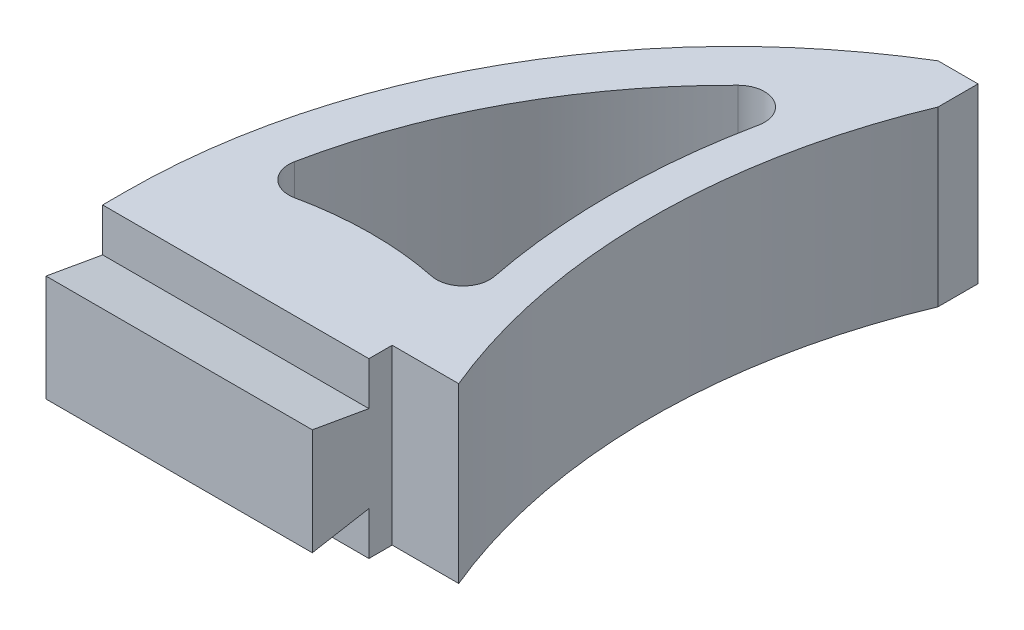
ISO-10303-21;
HEADER;
FILE_DESCRIPTION(('STEP AP214'),'2;1');
FILE_NAME('part.step','',(''),(''),'','','');
FILE_SCHEMA(('AUTOMOTIVE_DESIGN { 1 0 10303 214 1 1 1 1 }'));
ENDSEC;
DATA;
#1=APPLICATION_CONTEXT('core data for automotive mechanical design processes');
#2=APPLICATION_PROTOCOL_DEFINITION('international standard','automotive_design',2000,#1);
#3=PRODUCT_CONTEXT('',#1,'mechanical');
#4=PRODUCT('Part','Part','',(#3));
#5=PRODUCT_RELATED_PRODUCT_CATEGORY('part','',(#4));
#6=PRODUCT_DEFINITION_FORMATION('','',#4);
#7=PRODUCT_DEFINITION_CONTEXT('part definition',#1,'design');
#8=PRODUCT_DEFINITION('design','',#6,#7);
#9=PRODUCT_DEFINITION_SHAPE('','',#8);
#10=(LENGTH_UNIT() NAMED_UNIT(*) SI_UNIT(.MILLI.,.METRE.));
#11=(NAMED_UNIT(*) PLANE_ANGLE_UNIT() SI_UNIT($,.RADIAN.));
#12=(NAMED_UNIT(*) SI_UNIT($,.STERADIAN.) SOLID_ANGLE_UNIT());
#13=UNCERTAINTY_MEASURE_WITH_UNIT(LENGTH_MEASURE(1.E-05),#10,'distance_accuracy_value','');
#14=(GEOMETRIC_REPRESENTATION_CONTEXT(3) GLOBAL_UNCERTAINTY_ASSIGNED_CONTEXT((#13)) GLOBAL_UNIT_ASSIGNED_CONTEXT((#10,
#11,#12)) REPRESENTATION_CONTEXT('',''));
#15=CARTESIAN_POINT('',(0.,0.,0.));
#16=DIRECTION('',(0.,0.,1.));
#17=DIRECTION('',(1.,0.,0.));
#18=AXIS2_PLACEMENT_3D('',#15,#16,#17);
#19=CARTESIAN_POINT('',(45.5681818181818,13.,0.));
#20=DIRECTION('',(0.,-1.,0.));
#21=DIRECTION('',(0.,0.,-1.));
#22=AXIS2_PLACEMENT_3D('',#19,#20,#21);
#23=CYLINDRICAL_SURFACE('',#22,42.);
#24=CARTESIAN_POINT('',(45.5681818181818,0.,0.));
#25=DIRECTION('',(0.,1.,0.));
#26=DIRECTION('',(0.,0.,1.));
#27=AXIS2_PLACEMENT_3D('',#24,#25,#26);
#28=CIRCLE('',#27,42.);
#29=CARTESIAN_POINT('',(16.0800590579463,0.,-29.9073672541947));
#30=VERTEX_POINT('',#29);
#31=CARTESIAN_POINT('',(4.39239940253098,0.,-8.27979120865837));
#32=VERTEX_POINT('',#31);
#33=EDGE_CURVE('E259',#30,#32,#28,.T.);
#34=ORIENTED_EDGE('',*,*,#33,.F.);
#35=DIRECTION('',(0.,-1.,0.));
#36=VECTOR('',#35,1.);
#37=CARTESIAN_POINT('',(16.0800590579463,13.,-29.9073672541947));
#38=LINE('',#37,#36);
#39=CARTESIAN_POINT('',(16.0800590579463,13.,-29.9073672541947));
#40=VERTEX_POINT('',#39);
#41=EDGE_CURVE('E300',#40,#30,#38,.T.);
#42=ORIENTED_EDGE('',*,*,#41,.F.);
#43=CARTESIAN_POINT('',(45.5681818181818,13.,0.));
#44=DIRECTION('',(0.,1.,0.));
#45=DIRECTION('',(0.,0.,1.));
#46=AXIS2_PLACEMENT_3D('',#43,#44,#45);
#47=CIRCLE('',#46,42.);
#48=CARTESIAN_POINT('',(4.39239940253098,13.,-8.27979120865837));
#49=VERTEX_POINT('',#48);
#50=EDGE_CURVE('E202',#40,#49,#47,.T.);
#51=ORIENTED_EDGE('',*,*,#50,.T.);
#52=DIRECTION('',(0.,-1.,0.));
#53=VECTOR('',#52,1.);
#54=CARTESIAN_POINT('',(4.39239940253098,13.,-8.27979120865837));
#55=LINE('',#54,#53);
#56=EDGE_CURVE('E284',#49,#32,#55,.T.);
#57=ORIENTED_EDGE('',*,*,#56,.T.);
#58=EDGE_LOOP('',(#34,#42,#51,#57));
#59=FACE_BOUND('',#58,.T.);
#60=ADVANCED_FACE('F47',(#59),#23,.F.);
#61=CARTESIAN_POINT('',(17.4842553798623,13.,-28.4832069087568));
#62=DIRECTION('',(0.,-1.,0.));
#63=DIRECTION('',(0.,0.,-1.));
#64=AXIS2_PLACEMENT_3D('',#61,#62,#63);
#65=CYLINDRICAL_SURFACE('',#64,2.);
#66=CARTESIAN_POINT('',(17.4842553798623,0.,-28.4832069087568));
#67=DIRECTION('',(0.,1.,0.));
#68=DIRECTION('',(0.,0.,1.));
#69=AXIS2_PLACEMENT_3D('',#66,#67,#68);
#70=CIRCLE('',#69,2.);
#71=CARTESIAN_POINT('',(19.443191199567,0.,-28.0800066430354));
#72=VERTEX_POINT('',#71);
#73=EDGE_CURVE('E263',#30,#72,#70,.F.);
#74=ORIENTED_EDGE('',*,*,#73,.T.);
#75=DIRECTION('',(0.,-1.,0.));
#76=VECTOR('',#75,1.);
#77=CARTESIAN_POINT('',(19.443191199567,13.,-28.0800066430354));
#78=LINE('',#77,#76);
#79=CARTESIAN_POINT('',(19.443191199567,13.,-28.0800066430354));
#80=VERTEX_POINT('',#79);
#81=EDGE_CURVE('E297',#80,#72,#78,.T.);
#82=ORIENTED_EDGE('',*,*,#81,.F.);
#83=CARTESIAN_POINT('',(17.4842553798623,13.,-28.4832069087568));
#84=DIRECTION('',(0.,1.,0.));
#85=DIRECTION('',(0.,0.,1.));
#86=AXIS2_PLACEMENT_3D('',#83,#84,#85);
#87=CIRCLE('',#86,2.);
#88=EDGE_CURVE('E211',#40,#80,#87,.F.);
#89=ORIENTED_EDGE('',*,*,#88,.F.);
#90=ORIENTED_EDGE('',*,*,#41,.T.);
#91=EDGE_LOOP('',(#74,#82,#89,#90));
#92=FACE_BOUND('',#91,.T.);
#93=ADVANCED_FACE('F414',(#92),#65,.F.);
#94=CARTESIAN_POINT('',(68.4165866921848,13.,-18.));
#95=DIRECTION('',(0.,-1.,0.));
#96=DIRECTION('',(0.,0.,-1.));
#97=AXIS2_PLACEMENT_3D('',#94,#95,#96);
#98=CYLINDRICAL_SURFACE('',#97,50.);
#99=CARTESIAN_POINT('',(68.4165866921848,0.,-18.));
#100=DIRECTION('',(0.,1.,0.));
#101=DIRECTION('',(0.,0.,1.));
#102=AXIS2_PLACEMENT_3D('',#99,#100,#101);
#103=CIRCLE('',#102,50.);
#104=CARTESIAN_POINT('',(19.3623801460154,0.,-8.32090809395071));
#105=VERTEX_POINT('',#104);
#106=EDGE_CURVE('E267',#105,#72,#103,.F.);
#107=ORIENTED_EDGE('',*,*,#106,.F.);
#108=DIRECTION('',(0.,-1.,0.));
#109=VECTOR('',#108,1.);
#110=CARTESIAN_POINT('',(19.3623801460154,13.,-8.32090809395071));
#111=LINE('',#110,#109);
#112=CARTESIAN_POINT('',(19.3623801460154,13.,-8.32090809395071));
#113=VERTEX_POINT('',#112);
#114=EDGE_CURVE('E294',#113,#105,#111,.T.);
#115=ORIENTED_EDGE('',*,*,#114,.F.);
#116=CARTESIAN_POINT('',(68.4165866921848,13.,-18.));
#117=DIRECTION('',(0.,1.,0.));
#118=DIRECTION('',(0.,0.,1.));
#119=AXIS2_PLACEMENT_3D('',#116,#117,#118);
#120=CIRCLE('',#119,50.);
#121=EDGE_CURVE('E214',#113,#80,#120,.F.);
#122=ORIENTED_EDGE('',*,*,#121,.T.);
#123=ORIENTED_EDGE('',*,*,#81,.T.);
#124=EDGE_LOOP('',(#107,#115,#122,#123));
#125=FACE_BOUND('',#124,.T.);
#126=ADVANCED_FACE('F420',(#125),#98,.T.);
#127=CARTESIAN_POINT('',(17.4002118841686,13.,-7.93374441770875));
#128=DIRECTION('',(0.,-1.,0.));
#129=DIRECTION('',(0.,0.,-1.));
#130=AXIS2_PLACEMENT_3D('',#127,#128,#129);
#131=CYLINDRICAL_SURFACE('',#130,2.);
#132=CARTESIAN_POINT('',(17.4002118841686,0.,-7.93374441770875));
#133=DIRECTION('',(0.,1.,0.));
#134=DIRECTION('',(0.,0.,1.));
#135=AXIS2_PLACEMENT_3D('',#132,#133,#134);
#136=CIRCLE('',#135,2.);
#137=CARTESIAN_POINT('',(16.9996082789078,0.,-5.97427593073273));
#138=VERTEX_POINT('',#137);
#139=EDGE_CURVE('E271',#138,#105,#136,.T.);
#140=ORIENTED_EDGE('',*,*,#139,.F.);
#141=DIRECTION('',(0.,-1.,0.));
#142=VECTOR('',#141,1.);
#143=CARTESIAN_POINT('',(16.9996082789078,13.,-5.97427593073273));
#144=LINE('',#143,#142);
#145=CARTESIAN_POINT('',(16.9996082789078,13.,-5.97427593073273));
#146=VERTEX_POINT('',#145);
#147=EDGE_CURVE('E291',#146,#138,#144,.T.);
#148=ORIENTED_EDGE('',*,*,#147,.F.);
#149=CARTESIAN_POINT('',(17.4002118841686,13.,-7.93374441770875));
#150=DIRECTION('',(0.,1.,0.));
#151=DIRECTION('',(0.,0.,1.));
#152=AXIS2_PLACEMENT_3D('',#149,#150,#151);
#153=CIRCLE('',#152,2.);
#154=EDGE_CURVE('E218',#146,#113,#153,.T.);
#155=ORIENTED_EDGE('',*,*,#154,.T.);
#156=ORIENTED_EDGE('',*,*,#114,.T.);
#157=EDGE_LOOP('',(#140,#148,#155,#156));
#158=FACE_BOUND('',#157,.T.);
#159=ADVANCED_FACE('F574',(#158),#131,.F.);
#160=CARTESIAN_POINT('',(11.9920632131476,13.,18.5190801564673));
#161=DIRECTION('',(0.,-1.,0.));
#162=DIRECTION('',(0.,0.,-1.));
#163=AXIS2_PLACEMENT_3D('',#160,#161,#162);
#164=CYLINDRICAL_SURFACE('',#163,25.);
#165=CARTESIAN_POINT('',(11.9920632131476,0.,18.5190801564673));
#166=DIRECTION('',(0.,1.,0.));
#167=DIRECTION('',(0.,0.,1.));
#168=AXIS2_PLACEMENT_3D('',#165,#166,#167);
#169=CIRCLE('',#168,25.);
#170=CARTESIAN_POINT('',(6.77084815109741,0.,-5.92961946694456));
#171=VERTEX_POINT('',#170);
#172=EDGE_CURVE('E275',#171,#138,#169,.F.);
#173=ORIENTED_EDGE('',*,*,#172,.F.);
#174=DIRECTION('',(0.,-1.,0.));
#175=VECTOR('',#174,1.);
#176=CARTESIAN_POINT('',(6.77084815109741,13.,-5.92961946694456));
#177=LINE('',#176,#175);
#178=CARTESIAN_POINT('',(6.77084815109741,13.,-5.92961946694456));
#179=VERTEX_POINT('',#178);
#180=EDGE_CURVE('E287',#179,#171,#177,.T.);
#181=ORIENTED_EDGE('',*,*,#180,.F.);
#182=CARTESIAN_POINT('',(11.9920632131476,13.,18.5190801564673));
#183=DIRECTION('',(0.,1.,0.));
#184=DIRECTION('',(0.,0.,1.));
#185=AXIS2_PLACEMENT_3D('',#182,#183,#184);
#186=CIRCLE('',#185,25.);
#187=EDGE_CURVE('E222',#179,#146,#186,.F.);
#188=ORIENTED_EDGE('',*,*,#187,.T.);
#189=ORIENTED_EDGE('',*,*,#147,.T.);
#190=EDGE_LOOP('',(#173,#181,#188,#189));
#191=FACE_BOUND('',#190,.T.);
#192=ADVANCED_FACE('F565',(#191),#164,.T.);
#193=CARTESIAN_POINT('',(0.,13.,0.));
#194=DIRECTION('',(0.,0.,-1.));
#195=DIRECTION('',(-1.,0.,0.));
#196=AXIS2_PLACEMENT_3D('',#193,#194,#195);
#197=PLANE('',#196);
#198=DIRECTION('',(1.,0.,0.));
#199=VECTOR('',#198,1.);
#200=CARTESIAN_POINT('',(0.,0.,0.));
#201=LINE('',#200,#199);
#202=CARTESIAN_POINT('',(20.,0.,0.));
#203=VERTEX_POINT('',#202);
#204=CARTESIAN_POINT('',(25.,0.,0.));
#205=VERTEX_POINT('',#204);
#206=EDGE_CURVE('E231',#203,#205,#201,.T.);
#207=ORIENTED_EDGE('',*,*,#206,.T.);
#208=DIRECTION('',(0.,-1.,0.));
#209=VECTOR('',#208,1.);
#210=CARTESIAN_POINT('',(25.,13.,0.));
#211=LINE('',#210,#209);
#212=CARTESIAN_POINT('',(25.,13.,0.));
#213=VERTEX_POINT('',#212);
#214=EDGE_CURVE('E288',#213,#205,#211,.T.);
#215=ORIENTED_EDGE('',*,*,#214,.F.);
#216=DIRECTION('',(1.,0.,0.));
#217=VECTOR('',#216,1.);
#218=CARTESIAN_POINT('',(0.,13.,0.));
#219=LINE('',#218,#217);
#220=CARTESIAN_POINT('',(20.,13.,0.));
#221=VERTEX_POINT('',#220);
#222=EDGE_CURVE('E283',#221,#213,#219,.T.);
#223=ORIENTED_EDGE('',*,*,#222,.F.);
#224=DIRECTION('',(0.,-1.,0.));
#225=VECTOR('',#224,1.);
#226=CARTESIAN_POINT('',(20.,13.,0.));
#227=LINE('',#226,#225);
#228=EDGE_CURVE('E230',#221,#203,#227,.T.);
#229=ORIENTED_EDGE('',*,*,#228,.T.);
#230=EDGE_LOOP('',(#207,#215,#223,#229));
#231=FACE_BOUND('',#230,.T.);
#232=ADVANCED_FACE('F49',(#231),#197,.F.);
#233=CARTESIAN_POINT('',(68.4165866921848,13.,-18.));
#234=DIRECTION('',(0.,-1.,0.));
#235=DIRECTION('',(0.,0.,-1.));
#236=AXIS2_PLACEMENT_3D('',#233,#234,#235);
#237=CYLINDRICAL_SURFACE('',#236,47.);
#238=CARTESIAN_POINT('',(68.4165866921848,0.,-18.));
#239=DIRECTION('',(0.,1.,0.));
#240=DIRECTION('',(0.,0.,1.));
#241=AXIS2_PLACEMENT_3D('',#238,#239,#240);
#242=CIRCLE('',#241,47.);
#243=CARTESIAN_POINT('',(25.,0.,-36.));
#244=VERTEX_POINT('',#243);
#245=EDGE_CURVE('E235',#205,#244,#242,.F.);
#246=ORIENTED_EDGE('',*,*,#245,.T.);
#247=DIRECTION('',(0.,-1.,0.));
#248=VECTOR('',#247,1.);
#249=CARTESIAN_POINT('',(25.,13.,-36.));
#250=LINE('',#249,#248);
#251=CARTESIAN_POINT('',(25.,13.,-36.));
#252=VERTEX_POINT('',#251);
#253=EDGE_CURVE('E322',#252,#244,#250,.T.);
#254=ORIENTED_EDGE('',*,*,#253,.F.);
#255=CARTESIAN_POINT('',(68.4165866921848,13.,-18.));
#256=DIRECTION('',(0.,1.,0.));
#257=DIRECTION('',(0.,0.,1.));
#258=AXIS2_PLACEMENT_3D('',#255,#256,#257);
#259=CIRCLE('',#258,47.);
#260=EDGE_CURVE('E374',#213,#252,#259,.F.);
#261=ORIENTED_EDGE('',*,*,#260,.F.);
#262=ORIENTED_EDGE('',*,*,#214,.T.);
#263=EDGE_LOOP('',(#246,#254,#261,#262));
#264=FACE_BOUND('',#263,.T.);
#265=ADVANCED_FACE('F402',(#264),#237,.F.);
#266=CARTESIAN_POINT('',(25.,13.,0.));
#267=DIRECTION('',(1.,0.,0.));
#268=DIRECTION('',(0.,0.,-1.));
#269=AXIS2_PLACEMENT_3D('',#266,#267,#268);
#270=PLANE('',#269);
#271=DIRECTION('',(0.,0.,1.));
#272=VECTOR('',#271,1.);
#273=CARTESIAN_POINT('',(25.,0.,0.));
#274=LINE('',#273,#272);
#275=CARTESIAN_POINT('',(25.,0.,-39.));
#276=VERTEX_POINT('',#275);
#277=EDGE_CURVE('E239',#276,#244,#274,.T.);
#278=ORIENTED_EDGE('',*,*,#277,.F.);
#279=DIRECTION('',(0.,-1.,0.));
#280=VECTOR('',#279,1.);
#281=CARTESIAN_POINT('',(25.,13.,-39.));
#282=LINE('',#281,#280);
#283=CARTESIAN_POINT('',(25.,13.,-39.));
#284=VERTEX_POINT('',#283);
#285=EDGE_CURVE('E319',#284,#276,#282,.T.);
#286=ORIENTED_EDGE('',*,*,#285,.F.);
#287=DIRECTION('',(0.,0.,1.));
#288=VECTOR('',#287,1.);
#289=CARTESIAN_POINT('',(25.,13.,0.));
#290=LINE('',#289,#288);
#291=EDGE_CURVE('E377',#284,#252,#290,.T.);
#292=ORIENTED_EDGE('',*,*,#291,.T.);
#293=ORIENTED_EDGE('',*,*,#253,.T.);
#294=EDGE_LOOP('',(#278,#286,#292,#293));
#295=FACE_BOUND('',#294,.T.);
#296=ADVANCED_FACE('F405',(#295),#270,.T.);
#297=CARTESIAN_POINT('',(0.,13.,-39.));
#298=DIRECTION('',(0.,0.,1.));
#299=DIRECTION('',(1.,0.,0.));
#300=AXIS2_PLACEMENT_3D('',#297,#298,#299);
#301=PLANE('',#300);
#302=DIRECTION('',(-1.,0.,0.));
#303=VECTOR('',#302,1.);
#304=CARTESIAN_POINT('',(0.,0.,-39.));
#305=LINE('',#304,#303);
#306=CARTESIAN_POINT('',(22.,0.,-39.));
#307=VERTEX_POINT('',#306);
#308=EDGE_CURVE('E243',#276,#307,#305,.T.);
#309=ORIENTED_EDGE('',*,*,#308,.T.);
#310=DIRECTION('',(0.,-1.,0.));
#311=VECTOR('',#310,1.);
#312=CARTESIAN_POINT('',(22.,13.,-39.));
#313=LINE('',#312,#311);
#314=CARTESIAN_POINT('',(22.,13.,-39.));
#315=VERTEX_POINT('',#314);
#316=EDGE_CURVE('E316',#315,#307,#313,.T.);
#317=ORIENTED_EDGE('',*,*,#316,.F.);
#318=DIRECTION('',(-1.,0.,0.));
#319=VECTOR('',#318,1.);
#320=CARTESIAN_POINT('',(0.,13.,-39.));
#321=LINE('',#320,#319);
#322=EDGE_CURVE('E204',#284,#315,#321,.T.);
#323=ORIENTED_EDGE('',*,*,#322,.F.);
#324=ORIENTED_EDGE('',*,*,#285,.T.);
#325=EDGE_LOOP('',(#309,#317,#323,#324));
#326=FACE_BOUND('',#325,.T.);
#327=ADVANCED_FACE('F385',(#326),#301,.F.);
#328=CARTESIAN_POINT('',(45.5681818181818,13.,0.));
#329=DIRECTION('',(0.,-1.,0.));
#330=DIRECTION('',(0.,0.,-1.));
#331=AXIS2_PLACEMENT_3D('',#328,#329,#330);
#332=CYLINDRICAL_SURFACE('',#331,45.5681818181818);
#333=CARTESIAN_POINT('',(45.5681818181818,0.,0.));
#334=DIRECTION('',(0.,1.,0.));
#335=DIRECTION('',(0.,0.,1.));
#336=AXIS2_PLACEMENT_3D('',#333,#334,#335);
#337=CIRCLE('',#336,45.5681818181818);
#338=CARTESIAN_POINT('',(0.,0.,0.));
#339=VERTEX_POINT('',#338);
#340=EDGE_CURVE('E247',#339,#307,#337,.F.);
#341=ORIENTED_EDGE('',*,*,#340,.F.);
#342=DIRECTION('',(0.,-1.,0.));
#343=VECTOR('',#342,1.);
#344=CARTESIAN_POINT('',(0.,13.,0.));
#345=LINE('',#344,#343);
#346=CARTESIAN_POINT('',(0.,13.,0.));
#347=VERTEX_POINT('',#346);
#348=EDGE_CURVE('E313',#347,#339,#345,.T.);
#349=ORIENTED_EDGE('',*,*,#348,.F.);
#350=CARTESIAN_POINT('',(45.5681818181818,13.,0.));
#351=DIRECTION('',(0.,1.,0.));
#352=DIRECTION('',(0.,0.,1.));
#353=AXIS2_PLACEMENT_3D('',#350,#351,#352);
#354=CIRCLE('',#353,45.5681818181818);
#355=EDGE_CURVE('E196',#347,#315,#354,.F.);
#356=ORIENTED_EDGE('',*,*,#355,.T.);
#357=ORIENTED_EDGE('',*,*,#316,.T.);
#358=EDGE_LOOP('',(#341,#349,#356,#357));
#359=FACE_BOUND('',#358,.T.);
#360=ADVANCED_FACE('F389',(#359),#332,.T.);
#361=CARTESIAN_POINT('',(0.,13.,0.));
#362=DIRECTION('',(1.,0.,0.));
#363=DIRECTION('',(0.,0.,-1.));
#364=AXIS2_PLACEMENT_3D('',#361,#362,#363);
#365=PLANE('',#364);
#366=DIRECTION('',(0.,-1.,0.));
#367=VECTOR('',#366,1.);
#368=CARTESIAN_POINT('',(0.,13.,6.));
#369=LINE('',#368,#367);
#370=CARTESIAN_POINT('',(0.,10.5,6.));
#371=VERTEX_POINT('',#370);
#372=CARTESIAN_POINT('',(0.,2.5,6.));
#373=VERTEX_POINT('',#372);
#374=EDGE_CURVE('E309',#371,#373,#369,.T.);
#375=ORIENTED_EDGE('',*,*,#374,.F.);
#376=DIRECTION('',(0.,0.173648177666935,0.984807753012207));
#377=VECTOR('',#376,1.);
#378=CARTESIAN_POINT('',(0.,9.75,1.74653863528683));
#379=LINE('',#378,#377);
#380=CARTESIAN_POINT('',(0.,9.75,1.74653863528683));
#381=VERTEX_POINT('',#380);
#382=EDGE_CURVE('E189',#381,#371,#379,.T.);
#383=ORIENTED_EDGE('',*,*,#382,.F.);
#384=DIRECTION('',(0.,-1.,0.));
#385=VECTOR('',#384,1.);
#386=CARTESIAN_POINT('',(0.,13.,1.74653863528683));
#387=LINE('',#386,#385);
#388=CARTESIAN_POINT('',(0.,13.,1.74653863528683));
#389=VERTEX_POINT('',#388);
#390=EDGE_CURVE('E174',#389,#381,#387,.T.);
#391=ORIENTED_EDGE('',*,*,#390,.F.);
#392=DIRECTION('',(0.,0.,1.));
#393=VECTOR('',#392,1.);
#394=CARTESIAN_POINT('',(0.,13.,0.));
#395=LINE('',#394,#393);
#396=EDGE_CURVE('E187',#347,#389,#395,.T.);
#397=ORIENTED_EDGE('',*,*,#396,.F.);
#398=ORIENTED_EDGE('',*,*,#348,.T.);
#399=DIRECTION('',(0.,0.,1.));
#400=VECTOR('',#399,1.);
#401=CARTESIAN_POINT('',(0.,0.,0.));
#402=LINE('',#401,#400);
#403=CARTESIAN_POINT('',(0.,0.,1.74653863528683));
#404=VERTEX_POINT('',#403);
#405=EDGE_CURVE('E251',#339,#404,#402,.T.);
#406=ORIENTED_EDGE('',*,*,#405,.T.);
#407=DIRECTION('',(0.,-1.,0.));
#408=VECTOR('',#407,1.);
#409=CARTESIAN_POINT('',(0.,0.,1.74653863528683));
#410=LINE('',#409,#408);
#411=CARTESIAN_POINT('',(0.,3.25,1.74653863528683));
#412=VERTEX_POINT('',#411);
#413=EDGE_CURVE('E71',#412,#404,#410,.T.);
#414=ORIENTED_EDGE('',*,*,#413,.F.);
#415=DIRECTION('',(0.,0.173648177666935,-0.984807753012207));
#416=VECTOR('',#415,1.);
#417=CARTESIAN_POINT('',(0.,3.25,1.74653863528683));
#418=LINE('',#417,#416);
#419=EDGE_CURVE('E191',#373,#412,#418,.T.);
#420=ORIENTED_EDGE('',*,*,#419,.F.);
#421=EDGE_LOOP('',(#375,#383,#391,#397,#398,#406,#414,#420));
#422=FACE_BOUND('',#421,.T.);
#423=ADVANCED_FACE('F186',(#422),#365,.F.);
#424=CARTESIAN_POINT('',(0.,13.,6.));
#425=DIRECTION('',(0.,0.,-1.));
#426=DIRECTION('',(-1.,0.,0.));
#427=AXIS2_PLACEMENT_3D('',#424,#425,#426);
#428=PLANE('',#427);
#429=DIRECTION('',(0.,-1.,0.));
#430=VECTOR('',#429,1.);
#431=CARTESIAN_POINT('',(20.,13.,6.));
#432=LINE('',#431,#430);
#433=CARTESIAN_POINT('',(20.,10.5,6.));
#434=VERTEX_POINT('',#433);
#435=CARTESIAN_POINT('',(20.,2.5,6.));
#436=VERTEX_POINT('',#435);
#437=EDGE_CURVE('E305',#434,#436,#432,.T.);
#438=ORIENTED_EDGE('',*,*,#437,.F.);
#439=DIRECTION('',(-1.,0.,0.));
#440=VECTOR('',#439,1.);
#441=CARTESIAN_POINT('',(25.,10.5,6.));
#442=LINE('',#441,#440);
#443=EDGE_CURVE('E352',#434,#371,#442,.T.);
#444=ORIENTED_EDGE('',*,*,#443,.T.);
#445=ORIENTED_EDGE('',*,*,#374,.T.);
#446=DIRECTION('',(-1.,0.,0.));
#447=VECTOR('',#446,1.);
#448=CARTESIAN_POINT('',(25.,2.5,6.));
#449=LINE('',#448,#447);
#450=EDGE_CURVE('E336',#436,#373,#449,.T.);
#451=ORIENTED_EDGE('',*,*,#450,.F.);
#452=EDGE_LOOP('',(#438,#444,#445,#451));
#453=FACE_BOUND('',#452,.T.);
#454=ADVANCED_FACE('F343',(#453),#428,.F.);
#455=CARTESIAN_POINT('',(20.,13.,0.));
#456=DIRECTION('',(1.,0.,0.));
#457=DIRECTION('',(0.,0.,-1.));
#458=AXIS2_PLACEMENT_3D('',#455,#456,#457);
#459=PLANE('',#458);
#460=DIRECTION('',(0.,-0.173648177666935,-0.984807753012207));
#461=VECTOR('',#460,1.);
#462=CARTESIAN_POINT('',(20.,9.54932379404059,0.608447316799381));
#463=LINE('',#462,#461);
#464=CARTESIAN_POINT('',(20.,9.75,1.74653863528683));
#465=VERTEX_POINT('',#464);
#466=EDGE_CURVE('E11',#434,#465,#463,.T.);
#467=ORIENTED_EDGE('',*,*,#466,.F.);
#468=ORIENTED_EDGE('',*,*,#437,.T.);
#469=DIRECTION('',(0.,-0.173648177666935,0.984807753012207));
#470=VECTOR('',#469,1.);
#471=CARTESIAN_POINT('',(20.,3.84267417085103,-1.61468361481752));
#472=LINE('',#471,#470);
#473=CARTESIAN_POINT('',(20.,3.25,1.74653863528683));
#474=VERTEX_POINT('',#473);
#475=EDGE_CURVE('E56',#474,#436,#472,.T.);
#476=ORIENTED_EDGE('',*,*,#475,.F.);
#477=DIRECTION('',(0.,1.,0.));
#478=VECTOR('',#477,1.);
#479=CARTESIAN_POINT('',(20.,13.,1.74653863528683));
#480=LINE('',#479,#478);
#481=CARTESIAN_POINT('',(20.,0.,1.74653863528683));
#482=VERTEX_POINT('',#481);
#483=EDGE_CURVE('E357',#482,#474,#480,.T.);
#484=ORIENTED_EDGE('',*,*,#483,.F.);
#485=DIRECTION('',(0.,0.,1.));
#486=VECTOR('',#485,1.);
#487=CARTESIAN_POINT('',(20.,0.,0.));
#488=LINE('',#487,#486);
#489=EDGE_CURVE('E255',#203,#482,#488,.T.);
#490=ORIENTED_EDGE('',*,*,#489,.F.);
#491=ORIENTED_EDGE('',*,*,#228,.F.);
#492=DIRECTION('',(0.,0.,1.));
#493=VECTOR('',#492,1.);
#494=CARTESIAN_POINT('',(20.,13.,0.));
#495=LINE('',#494,#493);
#496=CARTESIAN_POINT('',(20.,13.,1.74653863528683));
#497=VERTEX_POINT('',#496);
#498=EDGE_CURVE('E198',#221,#497,#495,.T.);
#499=ORIENTED_EDGE('',*,*,#498,.T.);
#500=DIRECTION('',(0.,1.,0.));
#501=VECTOR('',#500,1.);
#502=CARTESIAN_POINT('',(20.,13.,1.74653863528683));
#503=LINE('',#502,#501);
#504=EDGE_CURVE('E63',#465,#497,#503,.T.);
#505=ORIENTED_EDGE('',*,*,#504,.F.);
#506=EDGE_LOOP('',(#467,#468,#476,#484,#490,#491,#499,#505));
#507=FACE_BOUND('',#506,.T.);
#508=ADVANCED_FACE('F348',(#507),#459,.T.);
#509=CARTESIAN_POINT('',(6.35315094613339,13.,-7.88551543681749));
#510=DIRECTION('',(0.,-1.,0.));
#511=DIRECTION('',(0.,0.,-1.));
#512=AXIS2_PLACEMENT_3D('',#509,#510,#511);
#513=CYLINDRICAL_SURFACE('',#512,2.);
#514=CARTESIAN_POINT('',(6.35315094613339,0.,-7.88551543681749));
#515=DIRECTION('',(0.,1.,0.));
#516=DIRECTION('',(0.,0.,1.));
#517=AXIS2_PLACEMENT_3D('',#514,#515,#516);
#518=CIRCLE('',#517,2.);
#519=EDGE_CURVE('E279',#32,#171,#518,.T.);
#520=ORIENTED_EDGE('',*,*,#519,.F.);
#521=ORIENTED_EDGE('',*,*,#56,.F.);
#522=CARTESIAN_POINT('',(6.35315094613339,13.,-7.88551543681749));
#523=DIRECTION('',(0.,1.,0.));
#524=DIRECTION('',(0.,0.,1.));
#525=AXIS2_PLACEMENT_3D('',#522,#523,#524);
#526=CIRCLE('',#525,2.);
#527=EDGE_CURVE('E226',#49,#179,#526,.T.);
#528=ORIENTED_EDGE('',*,*,#527,.T.);
#529=ORIENTED_EDGE('',*,*,#180,.T.);
#530=EDGE_LOOP('',(#520,#521,#528,#529));
#531=FACE_BOUND('',#530,.T.);
#532=ADVANCED_FACE('F428',(#531),#513,.F.);
#533=CARTESIAN_POINT('',(0.,13.,0.));
#534=DIRECTION('',(0.,1.,0.));
#535=DIRECTION('',(0.,0.,1.));
#536=AXIS2_PLACEMENT_3D('',#533,#534,#535);
#537=PLANE('',#536);
#538=DIRECTION('',(-1.,0.,0.));
#539=VECTOR('',#538,1.);
#540=CARTESIAN_POINT('',(0.,13.,1.74653863528683));
#541=LINE('',#540,#539);
#542=EDGE_CURVE('E171',#497,#389,#541,.T.);
#543=ORIENTED_EDGE('',*,*,#542,.F.);
#544=ORIENTED_EDGE('',*,*,#498,.F.);
#545=ORIENTED_EDGE('',*,*,#222,.T.);
#546=ORIENTED_EDGE('',*,*,#260,.T.);
#547=ORIENTED_EDGE('',*,*,#291,.F.);
#548=ORIENTED_EDGE('',*,*,#322,.T.);
#549=ORIENTED_EDGE('',*,*,#355,.F.);
#550=ORIENTED_EDGE('',*,*,#396,.T.);
#551=EDGE_LOOP('',(#543,#544,#545,#546,#547,#548,#549,#550));
#552=FACE_BOUND('',#551,.T.);
#553=ORIENTED_EDGE('',*,*,#50,.F.);
#554=ORIENTED_EDGE('',*,*,#88,.T.);
#555=ORIENTED_EDGE('',*,*,#121,.F.);
#556=ORIENTED_EDGE('',*,*,#154,.F.);
#557=ORIENTED_EDGE('',*,*,#187,.F.);
#558=ORIENTED_EDGE('',*,*,#527,.F.);
#559=EDGE_LOOP('',(#553,#554,#555,#556,#557,#558));
#560=FACE_BOUND('',#559,.T.);
#561=ADVANCED_FACE('F193',(#552,#560),#537,.T.);
#562=CARTESIAN_POINT('',(0.,0.,0.));
#563=DIRECTION('',(0.,1.,0.));
#564=DIRECTION('',(0.,0.,1.));
#565=AXIS2_PLACEMENT_3D('',#562,#563,#564);
#566=PLANE('',#565);
#567=ORIENTED_EDGE('',*,*,#489,.T.);
#568=DIRECTION('',(-1.,0.,0.));
#569=VECTOR('',#568,1.);
#570=CARTESIAN_POINT('',(0.,0.,1.74653863528683));
#571=LINE('',#570,#569);
#572=EDGE_CURVE('E181',#482,#404,#571,.T.);
#573=ORIENTED_EDGE('',*,*,#572,.T.);
#574=ORIENTED_EDGE('',*,*,#405,.F.);
#575=ORIENTED_EDGE('',*,*,#340,.T.);
#576=ORIENTED_EDGE('',*,*,#308,.F.);
#577=ORIENTED_EDGE('',*,*,#277,.T.);
#578=ORIENTED_EDGE('',*,*,#245,.F.);
#579=ORIENTED_EDGE('',*,*,#206,.F.);
#580=EDGE_LOOP('',(#567,#573,#574,#575,#576,#577,#578,#579));
#581=FACE_BOUND('',#580,.T.);
#582=ORIENTED_EDGE('',*,*,#33,.T.);
#583=ORIENTED_EDGE('',*,*,#519,.T.);
#584=ORIENTED_EDGE('',*,*,#172,.T.);
#585=ORIENTED_EDGE('',*,*,#139,.T.);
#586=ORIENTED_EDGE('',*,*,#106,.T.);
#587=ORIENTED_EDGE('',*,*,#73,.F.);
#588=EDGE_LOOP('',(#582,#583,#584,#585,#586,#587));
#589=FACE_BOUND('',#588,.T.);
#590=ADVANCED_FACE('F392',(#581,#589),#566,.F.);
#591=CARTESIAN_POINT('',(25.,3.25,1.74653863528683));
#592=DIRECTION('',(0.,0.984807753012207,0.173648177666935));
#593=DIRECTION('',(0.,-0.173648177666935,0.984807753012207));
#594=AXIS2_PLACEMENT_3D('',#591,#592,#593);
#595=PLANE('',#594);
#596=ORIENTED_EDGE('',*,*,#475,.T.);
#597=ORIENTED_EDGE('',*,*,#450,.T.);
#598=ORIENTED_EDGE('',*,*,#419,.T.);
#599=DIRECTION('',(-1.,0.,0.));
#600=VECTOR('',#599,1.);
#601=CARTESIAN_POINT('',(25.,3.25,1.74653863528683));
#602=LINE('',#601,#600);
#603=EDGE_CURVE('E338',#474,#412,#602,.T.);
#604=ORIENTED_EDGE('',*,*,#603,.F.);
#605=EDGE_LOOP('',(#596,#597,#598,#604));
#606=FACE_BOUND('',#605,.T.);
#607=ADVANCED_FACE('F334',(#606),#595,.F.);
#608=CARTESIAN_POINT('',(25.,0.,1.74653863528683));
#609=DIRECTION('',(0.,0.,-1.));
#610=DIRECTION('',(0.,1.,0.));
#611=AXIS2_PLACEMENT_3D('',#608,#609,#610);
#612=PLANE('',#611);
#613=ORIENTED_EDGE('',*,*,#483,.T.);
#614=ORIENTED_EDGE('',*,*,#603,.T.);
#615=ORIENTED_EDGE('',*,*,#413,.T.);
#616=ORIENTED_EDGE('',*,*,#572,.F.);
#617=EDGE_LOOP('',(#613,#614,#615,#616));
#618=FACE_BOUND('',#617,.T.);
#619=ADVANCED_FACE('F396',(#618),#612,.F.);
#620=CARTESIAN_POINT('',(25.,9.75,1.74653863528683));
#621=DIRECTION('',(0.,-0.984807753012207,0.173648177666935));
#622=DIRECTION('',(0.,-0.173648177666935,-0.984807753012207));
#623=AXIS2_PLACEMENT_3D('',#620,#621,#622);
#624=PLANE('',#623);
#625=ORIENTED_EDGE('',*,*,#466,.T.);
#626=DIRECTION('',(-1.,0.,0.));
#627=VECTOR('',#626,1.);
#628=CARTESIAN_POINT('',(25.,9.75,1.74653863528683));
#629=LINE('',#628,#627);
#630=EDGE_CURVE('E351',#465,#381,#629,.T.);
#631=ORIENTED_EDGE('',*,*,#630,.T.);
#632=ORIENTED_EDGE('',*,*,#382,.T.);
#633=ORIENTED_EDGE('',*,*,#443,.F.);
#634=EDGE_LOOP('',(#625,#631,#632,#633));
#635=FACE_BOUND('',#634,.T.);
#636=ADVANCED_FACE('F350',(#635),#624,.F.);
#637=CARTESIAN_POINT('',(25.,13.,1.74653863528683));
#638=DIRECTION('',(0.,0.,-1.));
#639=DIRECTION('',(-1.,0.,0.));
#640=AXIS2_PLACEMENT_3D('',#637,#638,#639);
#641=PLANE('',#640);
#642=ORIENTED_EDGE('',*,*,#504,.T.);
#643=ORIENTED_EDGE('',*,*,#542,.T.);
#644=ORIENTED_EDGE('',*,*,#390,.T.);
#645=ORIENTED_EDGE('',*,*,#630,.F.);
#646=EDGE_LOOP('',(#642,#643,#644,#645));
#647=FACE_BOUND('',#646,.T.);
#648=ADVANCED_FACE('F173',(#647),#641,.F.);
#649=CLOSED_SHELL('',(#60,#93,#126,#159,#192,#232,#265,#296,#327,#360,#423,#454,#508,#532,#561,
#590,#607,#619,#636,#648));
#650=MANIFOLD_SOLID_BREP('B2',#649);
#651=ADVANCED_BREP_SHAPE_REPRESENTATION('',(#18,#650),#14);
#652=SHAPE_DEFINITION_REPRESENTATION(#9,#651);
ENDSEC;
END-ISO-10303-21;
